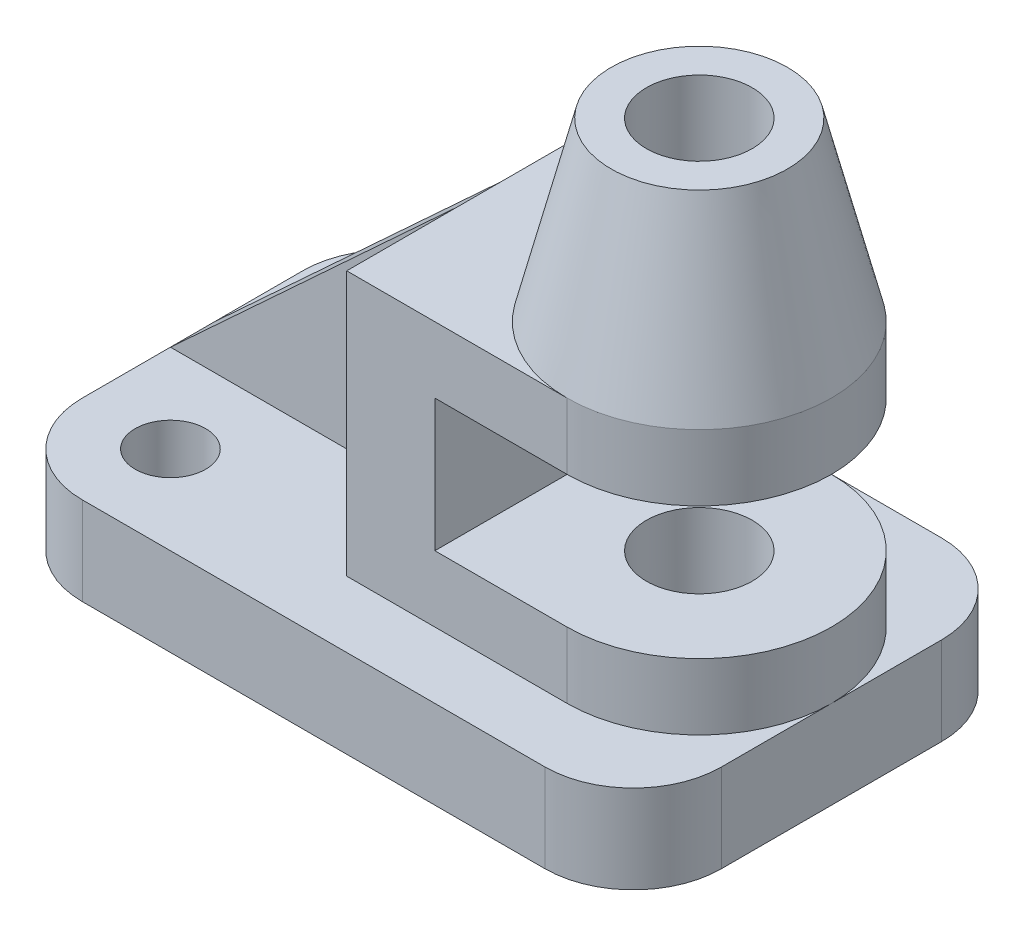
ISO-10303-21;
HEADER;
FILE_DESCRIPTION(('STEP AP214'),'2;1');
FILE_NAME('part.step','',(''),(''),'','','');
FILE_SCHEMA(('AUTOMOTIVE_DESIGN { 1 0 10303 214 1 1 1 1 }'));
ENDSEC;
DATA;
#1=APPLICATION_CONTEXT('core data for automotive mechanical design processes');
#2=APPLICATION_PROTOCOL_DEFINITION('international standard','automotive_design',2000,#1);
#3=PRODUCT_CONTEXT('',#1,'mechanical');
#4=PRODUCT('Part','Part','',(#3));
#5=PRODUCT_RELATED_PRODUCT_CATEGORY('part','',(#4));
#6=PRODUCT_DEFINITION_FORMATION('','',#4);
#7=PRODUCT_DEFINITION_CONTEXT('part definition',#1,'design');
#8=PRODUCT_DEFINITION('design','',#6,#7);
#9=PRODUCT_DEFINITION_SHAPE('','',#8);
#10=(LENGTH_UNIT() NAMED_UNIT(*) SI_UNIT(.MILLI.,.METRE.));
#11=(NAMED_UNIT(*) PLANE_ANGLE_UNIT() SI_UNIT($,.RADIAN.));
#12=(NAMED_UNIT(*) SI_UNIT($,.STERADIAN.) SOLID_ANGLE_UNIT());
#13=UNCERTAINTY_MEASURE_WITH_UNIT(LENGTH_MEASURE(1.E-05),#10,'distance_accuracy_value','');
#14=(GEOMETRIC_REPRESENTATION_CONTEXT(3) GLOBAL_UNCERTAINTY_ASSIGNED_CONTEXT((#13)) GLOBAL_UNIT_ASSIGNED_CONTEXT((#10,
#11,#12)) REPRESENTATION_CONTEXT('',''));
#15=CARTESIAN_POINT('',(0.,0.,0.));
#16=DIRECTION('',(0.,0.,1.));
#17=DIRECTION('',(1.,0.,0.));
#18=AXIS2_PLACEMENT_3D('',#15,#16,#17);
#19=CARTESIAN_POINT('',(55.1181876051147,48.213421502715,0.));
#20=DIRECTION('',(0.,-1.,0.));
#21=DIRECTION('',(0.,0.,-1.));
#22=AXIS2_PLACEMENT_3D('',#19,#20,#21);
#23=CYLINDRICAL_SURFACE('',#22,30.);
#24=DIRECTION('',(0.,-1.,0.));
#25=VECTOR('',#24,1.);
#26=CARTESIAN_POINT('',(55.1181876051147,48.213421502715,30.));
#27=LINE('',#26,#25);
#28=CARTESIAN_POINT('',(55.1181876051147,48.213421502715,30.));
#29=VERTEX_POINT('',#28);
#30=CARTESIAN_POINT('',(55.1181876051147,33.213421502715,30.));
#31=VERTEX_POINT('',#30);
#32=EDGE_CURVE('E187',#29,#31,#27,.T.);
#33=ORIENTED_EDGE('',*,*,#32,.T.);
#34=CARTESIAN_POINT('',(55.1181876051147,33.213421502715,0.));
#35=DIRECTION('',(0.,1.,0.));
#36=DIRECTION('',(0.,0.,1.));
#37=AXIS2_PLACEMENT_3D('',#34,#35,#36);
#38=CIRCLE('',#37,30.);
#39=CARTESIAN_POINT('',(55.1181876051147,33.213421502715,-30.));
#40=VERTEX_POINT('',#39);
#41=EDGE_CURVE('E360',#31,#40,#38,.T.);
#42=ORIENTED_EDGE('',*,*,#41,.T.);
#43=DIRECTION('',(0.,-1.,0.));
#44=VECTOR('',#43,1.);
#45=CARTESIAN_POINT('',(55.1181876051147,48.213421502715,-30.));
#46=LINE('',#45,#44);
#47=CARTESIAN_POINT('',(55.1181876051147,48.213421502715,-30.));
#48=VERTEX_POINT('',#47);
#49=EDGE_CURVE('E197',#48,#40,#46,.T.);
#50=ORIENTED_EDGE('',*,*,#49,.F.);
#51=CARTESIAN_POINT('',(55.1181876051147,48.213421502715,0.));
#52=DIRECTION('',(0.,1.,0.));
#53=DIRECTION('',(0.,0.,1.));
#54=AXIS2_PLACEMENT_3D('',#51,#52,#53);
#55=CIRCLE('',#54,30.);
#56=EDGE_CURVE('E168',#29,#48,#55,.T.);
#57=ORIENTED_EDGE('',*,*,#56,.F.);
#58=EDGE_LOOP('',(#33,#42,#50,#57));
#59=FACE_BOUND('',#58,.T.);
#60=ADVANCED_FACE('F32',(#59),#23,.T.);
#61=CARTESIAN_POINT('',(-59.8818123948853,-11.786578497285,45.));
#62=DIRECTION('',(1.,0.,0.));
#63=DIRECTION('',(0.,0.,-1.));
#64=AXIS2_PLACEMENT_3D('',#61,#62,#63);
#65=PLANE('',#64);
#66=DIRECTION('',(0.,0.,-1.));
#67=VECTOR('',#66,1.);
#68=CARTESIAN_POINT('',(-59.8818123948853,-11.786578497285,45.));
#69=LINE('',#68,#67);
#70=CARTESIAN_POINT('',(-59.8818123948853,-11.786578497285,-4.99999999999998));
#71=VERTEX_POINT('',#70);
#72=CARTESIAN_POINT('',(-59.8818123948853,-11.786578497285,-25.));
#73=VERTEX_POINT('',#72);
#74=EDGE_CURVE('E253',#71,#73,#69,.T.);
#75=ORIENTED_EDGE('',*,*,#74,.T.);
#76=DIRECTION('',(0.,-1.,0.));
#77=VECTOR('',#76,1.);
#78=CARTESIAN_POINT('',(-59.8818123948853,-11.786578497285,-25.));
#79=LINE('',#78,#77);
#80=CARTESIAN_POINT('',(-59.8818123948853,-31.786578497285,-25.));
#81=VERTEX_POINT('',#80);
#82=EDGE_CURVE('E284',#73,#81,#79,.T.);
#83=ORIENTED_EDGE('',*,*,#82,.T.);
#84=DIRECTION('',(0.,0.,-1.));
#85=VECTOR('',#84,1.);
#86=CARTESIAN_POINT('',(-59.8818123948853,-31.786578497285,45.));
#87=LINE('',#86,#85);
#88=CARTESIAN_POINT('',(-59.8818123948853,-31.786578497285,25.));
#89=VERTEX_POINT('',#88);
#90=EDGE_CURVE('E250',#89,#81,#87,.T.);
#91=ORIENTED_EDGE('',*,*,#90,.F.);
#92=DIRECTION('',(0.,-1.,0.));
#93=VECTOR('',#92,1.);
#94=CARTESIAN_POINT('',(-59.8818123948853,-11.786578497285,25.));
#95=LINE('',#94,#93);
#96=CARTESIAN_POINT('',(-59.8818123948853,-11.786578497285,25.));
#97=VERTEX_POINT('',#96);
#98=EDGE_CURVE('E279',#89,#97,#95,.F.);
#99=ORIENTED_EDGE('',*,*,#98,.T.);
#100=CARTESIAN_POINT('',(-59.8818123948853,-11.786578497285,5.));
#101=VERTEX_POINT('',#100);
#102=EDGE_CURVE('E254',#97,#101,#69,.T.);
#103=ORIENTED_EDGE('',*,*,#102,.T.);
#104=DIRECTION('',(0.,0.,-1.));
#105=VECTOR('',#104,1.);
#106=CARTESIAN_POINT('',(-59.8818123948853,-11.786578497285,240.600960312135));
#107=LINE('',#106,#105);
#108=EDGE_CURVE('E208',#101,#71,#107,.T.);
#109=ORIENTED_EDGE('',*,*,#108,.T.);
#110=EDGE_LOOP('',(#75,#83,#91,#99,#103,#109));
#111=FACE_BOUND('',#110,.T.);
#112=ADVANCED_FACE('F332',(#111),#65,.F.);
#113=CARTESIAN_POINT('',(0.,48.213421502715,5.00000000000001));
#114=DIRECTION('',(0.,0.,-1.));
#115=DIRECTION('',(-1.,0.,0.));
#116=AXIS2_PLACEMENT_3D('',#113,#114,#115);
#117=PLANE('',#116);
#118=DIRECTION('',(-0.734803444627488,-0.678280102733066,0.));
#119=VECTOR('',#118,1.);
#120=CARTESIAN_POINT('',(-59.8818123948853,-11.786578497285,5.));
#121=LINE('',#120,#119);
#122=CARTESIAN_POINT('',(5.11818760511466,48.213421502715,5.00000000000001));
#123=VERTEX_POINT('',#122);
#124=EDGE_CURVE('E421',#123,#101,#121,.T.);
#125=ORIENTED_EDGE('',*,*,#124,.T.);
#126=DIRECTION('',(1.,0.,0.));
#127=VECTOR('',#126,1.);
#128=CARTESIAN_POINT('',(0.,-11.786578497285,5.00000000000001));
#129=LINE('',#128,#127);
#130=CARTESIAN_POINT('',(5.11818760511466,-11.786578497285,5.00000000000001));
#131=VERTEX_POINT('',#130);
#132=EDGE_CURVE('E205',#101,#131,#129,.T.);
#133=ORIENTED_EDGE('',*,*,#132,.T.);
#134=DIRECTION('',(0.,-1.,0.));
#135=VECTOR('',#134,1.);
#136=CARTESIAN_POINT('',(5.11818760511466,48.213421502715,5.00000000000001));
#137=LINE('',#136,#135);
#138=EDGE_CURVE('E232',#123,#131,#137,.T.);
#139=ORIENTED_EDGE('',*,*,#138,.F.);
#140=EDGE_LOOP('',(#125,#133,#139));
#141=FACE_BOUND('',#140,.T.);
#142=ADVANCED_FACE('F338',(#141),#117,.F.);
#143=CARTESIAN_POINT('',(0.,48.213421502715,0.));
#144=DIRECTION('',(0.,1.,0.));
#145=DIRECTION('',(0.,0.,1.));
#146=AXIS2_PLACEMENT_3D('',#143,#144,#145);
#147=PLANE('',#146);
#148=DIRECTION('',(1.,0.,0.));
#149=VECTOR('',#148,1.);
#150=CARTESIAN_POINT('',(0.,48.213421502715,30.));
#151=LINE('',#150,#149);
#152=CARTESIAN_POINT('',(5.11818760511466,48.213421502715,30.));
#153=VERTEX_POINT('',#152);
#154=EDGE_CURVE('E177',#153,#29,#151,.T.);
#155=ORIENTED_EDGE('',*,*,#154,.T.);
#156=CARTESIAN_POINT('',(55.1181876051147,48.213421502715,0.));
#157=DIRECTION('',(0.,-1.,0.));
#158=DIRECTION('',(0.,0.,-1.));
#159=AXIS2_PLACEMENT_3D('',#156,#157,#158);
#160=CIRCLE('',#159,30.);
#161=EDGE_CURVE('E163',#29,#48,#160,.T.);
#162=ORIENTED_EDGE('',*,*,#161,.T.);
#163=DIRECTION('',(1.,0.,0.));
#164=VECTOR('',#163,1.);
#165=CARTESIAN_POINT('',(0.,48.213421502715,-30.));
#166=LINE('',#165,#164);
#167=CARTESIAN_POINT('',(5.11818760511466,48.213421502715,-30.));
#168=VERTEX_POINT('',#167);
#169=EDGE_CURVE('E199',#168,#48,#166,.T.);
#170=ORIENTED_EDGE('',*,*,#169,.F.);
#171=DIRECTION('',(0.,0.,-1.));
#172=VECTOR('',#171,1.);
#173=CARTESIAN_POINT('',(5.11818760511466,48.213421502715,0.));
#174=LINE('',#173,#172);
#175=CARTESIAN_POINT('',(5.11818760511466,48.213421502715,-4.99999999999998));
#176=VERTEX_POINT('',#175);
#177=EDGE_CURVE('E201',#176,#168,#174,.T.);
#178=ORIENTED_EDGE('',*,*,#177,.F.);
#179=DIRECTION('',(0.,0.,-1.));
#180=VECTOR('',#179,1.);
#181=CARTESIAN_POINT('',(5.11818760511466,48.213421502715,240.600960312135));
#182=LINE('',#181,#180);
#183=EDGE_CURVE('E400',#123,#176,#182,.T.);
#184=ORIENTED_EDGE('',*,*,#183,.F.);
#185=EDGE_CURVE('E182',#153,#123,#174,.T.);
#186=ORIENTED_EDGE('',*,*,#185,.F.);
#187=EDGE_LOOP('',(#155,#162,#170,#178,#184,#186));
#188=FACE_BOUND('',#187,.T.);
#189=ADVANCED_FACE('F179',(#188),#147,.T.);
#190=CARTESIAN_POINT('',(85.1181876051147,-11.786578497285,45.));
#191=DIRECTION('',(0.,-1.,0.));
#192=DIRECTION('',(0.,0.,-1.));
#193=AXIS2_PLACEMENT_3D('',#190,#191,#192);
#194=PLANE('',#193);
#195=CARTESIAN_POINT('',(-39.8818123948853,-11.786578497285,25.));
#196=DIRECTION('',(0.,1.,0.));
#197=DIRECTION('',(0.,0.,1.));
#198=AXIS2_PLACEMENT_3D('',#195,#196,#197);
#199=CIRCLE('',#198,8.00000000000001);
#200=CARTESIAN_POINT('',(-39.8818123948853,-11.786578497285,33.));
#201=VERTEX_POINT('',#200);
#202=EDGE_CURVE('E271',#201,#201,#199,.T.);
#203=ORIENTED_EDGE('',*,*,#202,.F.);
#204=EDGE_LOOP('',(#203));
#205=FACE_BOUND('',#204,.T.);
#206=DIRECTION('',(-1.,0.,0.));
#207=VECTOR('',#206,1.);
#208=CARTESIAN_POINT('',(85.1181876051147,-11.786578497285,45.));
#209=LINE('',#208,#207);
#210=CARTESIAN_POINT('',(65.1181876051147,-11.786578497285,45.));
#211=VERTEX_POINT('',#210);
#212=CARTESIAN_POINT('',(-39.8818123948853,-11.786578497285,45.));
#213=VERTEX_POINT('',#212);
#214=EDGE_CURVE('E236',#211,#213,#209,.T.);
#215=ORIENTED_EDGE('',*,*,#214,.F.);
#216=CARTESIAN_POINT('',(65.1181876051147,-11.786578497285,25.));
#217=DIRECTION('',(0.,-1.,0.));
#218=DIRECTION('',(0.,0.,-1.));
#219=AXIS2_PLACEMENT_3D('',#216,#217,#218);
#220=CIRCLE('',#219,20.);
#221=CARTESIAN_POINT('',(85.1181876051147,-11.786578497285,25.));
#222=VERTEX_POINT('',#221);
#223=EDGE_CURVE('E54',#211,#222,#220,.F.);
#224=ORIENTED_EDGE('',*,*,#223,.T.);
#225=DIRECTION('',(0.,0.,-1.));
#226=VECTOR('',#225,1.);
#227=CARTESIAN_POINT('',(85.1181876051147,-11.786578497285,45.));
#228=LINE('',#227,#226);
#229=CARTESIAN_POINT('',(85.1181876051147,-11.786578497285,0.));
#230=VERTEX_POINT('',#229);
#231=EDGE_CURVE('E246',#222,#230,#228,.T.);
#232=ORIENTED_EDGE('',*,*,#231,.T.);
#233=CARTESIAN_POINT('',(55.1181876051147,-11.786578497285,0.));
#234=DIRECTION('',(0.,1.,0.));
#235=DIRECTION('',(0.,0.,1.));
#236=AXIS2_PLACEMENT_3D('',#233,#234,#235);
#237=CIRCLE('',#236,30.);
#238=CARTESIAN_POINT('',(55.1181876051147,-11.786578497285,30.));
#239=VERTEX_POINT('',#238);
#240=EDGE_CURVE('E215',#239,#230,#237,.T.);
#241=ORIENTED_EDGE('',*,*,#240,.F.);
#242=DIRECTION('',(1.,0.,0.));
#243=VECTOR('',#242,1.);
#244=CARTESIAN_POINT('',(0.,-11.786578497285,30.));
#245=LINE('',#244,#243);
#246=CARTESIAN_POINT('',(5.11818760511466,-11.786578497285,30.));
#247=VERTEX_POINT('',#246);
#248=EDGE_CURVE('E211',#247,#239,#245,.T.);
#249=ORIENTED_EDGE('',*,*,#248,.F.);
#250=DIRECTION('',(0.,0.,-1.));
#251=VECTOR('',#250,1.);
#252=CARTESIAN_POINT('',(5.11818760511466,-11.786578497285,0.));
#253=LINE('',#252,#251);
#254=EDGE_CURVE('E207',#247,#131,#253,.T.);
#255=ORIENTED_EDGE('',*,*,#254,.T.);
#256=ORIENTED_EDGE('',*,*,#132,.F.);
#257=ORIENTED_EDGE('',*,*,#102,.F.);
#258=CARTESIAN_POINT('',(-39.8818123948853,-11.786578497285,25.));
#259=DIRECTION('',(0.,-1.,0.));
#260=DIRECTION('',(0.,0.,-1.));
#261=AXIS2_PLACEMENT_3D('',#258,#259,#260);
#262=CIRCLE('',#261,20.);
#263=EDGE_CURVE('E281',#97,#213,#262,.F.);
#264=ORIENTED_EDGE('',*,*,#263,.T.);
#265=EDGE_LOOP('',(#215,#224,#232,#241,#249,#255,#256,#257,#264));
#266=FACE_BOUND('',#265,.T.);
#267=ADVANCED_FACE('F313',(#205,#266),#194,.F.);
#268=CARTESIAN_POINT('',(-39.8818123948853,-11.786578497285,-25.));
#269=DIRECTION('',(0.,1.,0.));
#270=DIRECTION('',(0.,0.,1.));
#271=AXIS2_PLACEMENT_3D('',#268,#269,#270);
#272=CIRCLE('',#271,8.00000000000001);
#273=CARTESIAN_POINT('',(-39.8818123948853,-11.786578497285,-17.));
#274=VERTEX_POINT('',#273);
#275=EDGE_CURVE('E441',#274,#274,#272,.T.);
#276=ORIENTED_EDGE('',*,*,#275,.F.);
#277=EDGE_LOOP('',(#276));
#278=FACE_BOUND('',#277,.T.);
#279=CARTESIAN_POINT('',(85.1181876051147,-11.786578497285,-25.));
#280=VERTEX_POINT('',#279);
#281=EDGE_CURVE('E242',#230,#280,#228,.T.);
#282=ORIENTED_EDGE('',*,*,#281,.T.);
#283=CARTESIAN_POINT('',(65.1181876051147,-11.786578497285,-25.));
#284=DIRECTION('',(0.,-1.,0.));
#285=DIRECTION('',(0.,0.,-1.));
#286=AXIS2_PLACEMENT_3D('',#283,#284,#285);
#287=CIRCLE('',#286,20.);
#288=CARTESIAN_POINT('',(65.1181876051147,-11.786578497285,-45.));
#289=VERTEX_POINT('',#288);
#290=EDGE_CURVE('E297',#280,#289,#287,.F.);
#291=ORIENTED_EDGE('',*,*,#290,.T.);
#292=DIRECTION('',(-1.,0.,0.));
#293=VECTOR('',#292,1.);
#294=CARTESIAN_POINT('',(85.1181876051147,-11.786578497285,-45.));
#295=LINE('',#294,#293);
#296=CARTESIAN_POINT('',(-39.8818123948853,-11.786578497285,-45.));
#297=VERTEX_POINT('',#296);
#298=EDGE_CURVE('E235',#289,#297,#295,.T.);
#299=ORIENTED_EDGE('',*,*,#298,.T.);
#300=CARTESIAN_POINT('',(-39.8818123948853,-11.786578497285,-25.));
#301=DIRECTION('',(0.,-1.,0.));
#302=DIRECTION('',(0.,0.,-1.));
#303=AXIS2_PLACEMENT_3D('',#300,#301,#302);
#304=CIRCLE('',#303,20.);
#305=EDGE_CURVE('E292',#297,#73,#304,.F.);
#306=ORIENTED_EDGE('',*,*,#305,.T.);
#307=ORIENTED_EDGE('',*,*,#74,.F.);
#308=DIRECTION('',(1.,0.,0.));
#309=VECTOR('',#308,1.);
#310=CARTESIAN_POINT('',(0.,-11.786578497285,-4.99999999999999));
#311=LINE('',#310,#309);
#312=CARTESIAN_POINT('',(5.11818760511466,-11.786578497285,-4.99999999999999));
#313=VERTEX_POINT('',#312);
#314=EDGE_CURVE('E222',#71,#313,#311,.T.);
#315=ORIENTED_EDGE('',*,*,#314,.T.);
#316=CARTESIAN_POINT('',(5.11818760511466,-11.786578497285,-30.));
#317=VERTEX_POINT('',#316);
#318=EDGE_CURVE('E212',#313,#317,#253,.T.);
#319=ORIENTED_EDGE('',*,*,#318,.T.);
#320=DIRECTION('',(1.,0.,0.));
#321=VECTOR('',#320,1.);
#322=CARTESIAN_POINT('',(0.,-11.786578497285,-30.));
#323=LINE('',#322,#321);
#324=CARTESIAN_POINT('',(55.1181876051147,-11.786578497285,-30.));
#325=VERTEX_POINT('',#324);
#326=EDGE_CURVE('E218',#317,#325,#323,.T.);
#327=ORIENTED_EDGE('',*,*,#326,.T.);
#328=EDGE_CURVE('E219',#230,#325,#237,.T.);
#329=ORIENTED_EDGE('',*,*,#328,.F.);
#330=EDGE_LOOP('',(#282,#291,#299,#306,#307,#315,#319,#327,#329));
#331=FACE_BOUND('',#330,.T.);
#332=ADVANCED_FACE('F378',(#278,#331),#194,.F.);
#333=CARTESIAN_POINT('',(-59.8818123948853,-31.786578497285,45.));
#334=DIRECTION('',(0.,1.,0.));
#335=DIRECTION('',(0.,0.,1.));
#336=AXIS2_PLACEMENT_3D('',#333,#334,#335);
#337=PLANE('',#336);
#338=CARTESIAN_POINT('',(-39.8818123948853,-31.786578497285,25.));
#339=DIRECTION('',(0.,1.,0.));
#340=DIRECTION('',(0.,0.,1.));
#341=AXIS2_PLACEMENT_3D('',#338,#339,#340);
#342=CIRCLE('',#341,8.00000000000001);
#343=CARTESIAN_POINT('',(-39.8818123948853,-31.786578497285,33.));
#344=VERTEX_POINT('',#343);
#345=EDGE_CURVE('E270',#344,#344,#342,.T.);
#346=ORIENTED_EDGE('',*,*,#345,.T.);
#347=EDGE_LOOP('',(#346));
#348=FACE_BOUND('',#347,.T.);
#349=CARTESIAN_POINT('',(-39.8818123948853,-31.786578497285,-25.));
#350=DIRECTION('',(0.,1.,0.));
#351=DIRECTION('',(0.,0.,1.));
#352=AXIS2_PLACEMENT_3D('',#349,#350,#351);
#353=CIRCLE('',#352,8.00000000000001);
#354=CARTESIAN_POINT('',(-39.8818123948853,-31.786578497285,-17.));
#355=VERTEX_POINT('',#354);
#356=EDGE_CURVE('E267',#355,#355,#353,.T.);
#357=ORIENTED_EDGE('',*,*,#356,.T.);
#358=EDGE_LOOP('',(#357));
#359=FACE_BOUND('',#358,.T.);
#360=CARTESIAN_POINT('',(55.1181876051147,-31.786578497285,0.));
#361=DIRECTION('',(0.,1.,0.));
#362=DIRECTION('',(0.,0.,1.));
#363=AXIS2_PLACEMENT_3D('',#360,#361,#362);
#364=CIRCLE('',#363,12.);
#365=CARTESIAN_POINT('',(55.1181876051147,-31.786578497285,12.));
#366=VERTEX_POINT('',#365);
#367=EDGE_CURVE('E430',#366,#366,#364,.F.);
#368=ORIENTED_EDGE('',*,*,#367,.F.);
#369=EDGE_LOOP('',(#368));
#370=FACE_BOUND('',#369,.T.);
#371=DIRECTION('',(0.,0.,-1.));
#372=VECTOR('',#371,1.);
#373=CARTESIAN_POINT('',(85.1181876051147,-31.786578497285,45.));
#374=LINE('',#373,#372);
#375=CARTESIAN_POINT('',(85.1181876051147,-31.786578497285,25.));
#376=VERTEX_POINT('',#375);
#377=CARTESIAN_POINT('',(85.1181876051147,-31.786578497285,-25.));
#378=VERTEX_POINT('',#377);
#379=EDGE_CURVE('E248',#376,#378,#374,.T.);
#380=ORIENTED_EDGE('',*,*,#379,.F.);
#381=CARTESIAN_POINT('',(65.1181876051147,-31.786578497285,25.));
#382=DIRECTION('',(0.,1.,0.));
#383=DIRECTION('',(0.,0.,1.));
#384=AXIS2_PLACEMENT_3D('',#381,#382,#383);
#385=CIRCLE('',#384,20.);
#386=CARTESIAN_POINT('',(65.1181876051147,-31.786578497285,45.));
#387=VERTEX_POINT('',#386);
#388=EDGE_CURVE('E11',#376,#387,#385,.F.);
#389=ORIENTED_EDGE('',*,*,#388,.T.);
#390=DIRECTION('',(1.,0.,0.));
#391=VECTOR('',#390,1.);
#392=CARTESIAN_POINT('',(-59.8818123948853,-31.786578497285,45.));
#393=LINE('',#392,#391);
#394=CARTESIAN_POINT('',(-39.8818123948853,-31.786578497285,45.));
#395=VERTEX_POINT('',#394);
#396=EDGE_CURVE('E238',#395,#387,#393,.T.);
#397=ORIENTED_EDGE('',*,*,#396,.F.);
#398=CARTESIAN_POINT('',(-39.8818123948853,-31.786578497285,25.));
#399=DIRECTION('',(0.,1.,0.));
#400=DIRECTION('',(0.,0.,1.));
#401=AXIS2_PLACEMENT_3D('',#398,#399,#400);
#402=CIRCLE('',#401,20.);
#403=EDGE_CURVE('E277',#395,#89,#402,.F.);
#404=ORIENTED_EDGE('',*,*,#403,.T.);
#405=ORIENTED_EDGE('',*,*,#90,.T.);
#406=CARTESIAN_POINT('',(-39.8818123948853,-31.786578497285,-25.));
#407=DIRECTION('',(0.,1.,0.));
#408=DIRECTION('',(0.,0.,1.));
#409=AXIS2_PLACEMENT_3D('',#406,#407,#408);
#410=CIRCLE('',#409,20.);
#411=CARTESIAN_POINT('',(-39.8818123948853,-31.786578497285,-45.));
#412=VERTEX_POINT('',#411);
#413=EDGE_CURVE('E287',#81,#412,#410,.F.);
#414=ORIENTED_EDGE('',*,*,#413,.T.);
#415=DIRECTION('',(1.,0.,0.));
#416=VECTOR('',#415,1.);
#417=CARTESIAN_POINT('',(-59.8818123948853,-31.786578497285,-45.));
#418=LINE('',#417,#416);
#419=CARTESIAN_POINT('',(65.1181876051147,-31.786578497285,-45.));
#420=VERTEX_POINT('',#419);
#421=EDGE_CURVE('E239',#412,#420,#418,.T.);
#422=ORIENTED_EDGE('',*,*,#421,.T.);
#423=CARTESIAN_POINT('',(65.1181876051147,-31.786578497285,-25.));
#424=DIRECTION('',(0.,1.,0.));
#425=DIRECTION('',(0.,0.,1.));
#426=AXIS2_PLACEMENT_3D('',#423,#424,#425);
#427=CIRCLE('',#426,20.);
#428=EDGE_CURVE('E301',#420,#378,#427,.F.);
#429=ORIENTED_EDGE('',*,*,#428,.T.);
#430=EDGE_LOOP('',(#380,#389,#397,#404,#405,#414,#422,#429));
#431=FACE_BOUND('',#430,.T.);
#432=ADVANCED_FACE('F322',(#348,#359,#370,#431),#337,.F.);
#433=CARTESIAN_POINT('',(85.1181876051147,-31.786578497285,45.));
#434=DIRECTION('',(-1.,0.,0.));
#435=DIRECTION('',(0.,0.,1.));
#436=AXIS2_PLACEMENT_3D('',#433,#434,#435);
#437=PLANE('',#436);
#438=ORIENTED_EDGE('',*,*,#231,.F.);
#439=DIRECTION('',(0.,1.,0.));
#440=VECTOR('',#439,1.);
#441=CARTESIAN_POINT('',(85.1181876051147,-31.786578497285,25.));
#442=LINE('',#441,#440);
#443=EDGE_CURVE('E40',#222,#376,#442,.F.);
#444=ORIENTED_EDGE('',*,*,#443,.T.);
#445=ORIENTED_EDGE('',*,*,#379,.T.);
#446=DIRECTION('',(0.,1.,0.));
#447=VECTOR('',#446,1.);
#448=CARTESIAN_POINT('',(85.1181876051147,-31.786578497285,-25.));
#449=LINE('',#448,#447);
#450=EDGE_CURVE('E294',#378,#280,#449,.T.);
#451=ORIENTED_EDGE('',*,*,#450,.T.);
#452=ORIENTED_EDGE('',*,*,#281,.F.);
#453=EDGE_LOOP('',(#438,#444,#445,#451,#452));
#454=FACE_BOUND('',#453,.T.);
#455=ADVANCED_FACE('F381',(#454),#437,.F.);
#456=CARTESIAN_POINT('',(0.,0.,45.));
#457=DIRECTION('',(0.,0.,1.));
#458=DIRECTION('',(1.,0.,0.));
#459=AXIS2_PLACEMENT_3D('',#456,#457,#458);
#460=PLANE('',#459);
#461=ORIENTED_EDGE('',*,*,#396,.T.);
#462=DIRECTION('',(0.,1.,0.));
#463=VECTOR('',#462,1.);
#464=CARTESIAN_POINT('',(65.1181876051147,-11.786578497285,45.));
#465=LINE('',#464,#463);
#466=EDGE_CURVE('E304',#387,#211,#465,.T.);
#467=ORIENTED_EDGE('',*,*,#466,.T.);
#468=ORIENTED_EDGE('',*,*,#214,.T.);
#469=DIRECTION('',(0.,-1.,0.));
#470=VECTOR('',#469,1.);
#471=CARTESIAN_POINT('',(-39.8818123948853,-31.786578497285,45.));
#472=LINE('',#471,#470);
#473=EDGE_CURVE('E172',#213,#395,#472,.T.);
#474=ORIENTED_EDGE('',*,*,#473,.T.);
#475=EDGE_LOOP('',(#461,#467,#468,#474));
#476=FACE_BOUND('',#475,.T.);
#477=ADVANCED_FACE('F309',(#476),#460,.T.);
#478=CARTESIAN_POINT('',(0.,0.,-45.));
#479=DIRECTION('',(0.,0.,1.));
#480=DIRECTION('',(1.,0.,0.));
#481=AXIS2_PLACEMENT_3D('',#478,#479,#480);
#482=PLANE('',#481);
#483=ORIENTED_EDGE('',*,*,#298,.F.);
#484=DIRECTION('',(0.,1.,0.));
#485=VECTOR('',#484,1.);
#486=CARTESIAN_POINT('',(65.1181876051147,0.,-45.));
#487=LINE('',#486,#485);
#488=EDGE_CURVE('E299',#289,#420,#487,.F.);
#489=ORIENTED_EDGE('',*,*,#488,.T.);
#490=ORIENTED_EDGE('',*,*,#421,.F.);
#491=DIRECTION('',(0.,-1.,0.));
#492=VECTOR('',#491,1.);
#493=CARTESIAN_POINT('',(-39.8818123948853,0.,-45.));
#494=LINE('',#493,#492);
#495=EDGE_CURVE('E289',#412,#297,#494,.F.);
#496=ORIENTED_EDGE('',*,*,#495,.T.);
#497=EDGE_LOOP('',(#483,#489,#490,#496));
#498=FACE_BOUND('',#497,.T.);
#499=ADVANCED_FACE('F387',(#498),#482,.F.);
#500=CARTESIAN_POINT('',(5.11818760511466,48.213421502715,0.));
#501=DIRECTION('',(-1.,0.,0.));
#502=DIRECTION('',(0.,0.,1.));
#503=AXIS2_PLACEMENT_3D('',#500,#501,#502);
#504=PLANE('',#503);
#505=ORIENTED_EDGE('',*,*,#254,.F.);
#506=DIRECTION('',(0.,-1.,0.));
#507=VECTOR('',#506,1.);
#508=CARTESIAN_POINT('',(5.11818760511466,48.213421502715,30.));
#509=LINE('',#508,#507);
#510=EDGE_CURVE('E193',#153,#247,#509,.T.);
#511=ORIENTED_EDGE('',*,*,#510,.F.);
#512=ORIENTED_EDGE('',*,*,#185,.T.);
#513=ORIENTED_EDGE('',*,*,#138,.T.);
#514=EDGE_LOOP('',(#505,#511,#512,#513));
#515=FACE_BOUND('',#514,.T.);
#516=ADVANCED_FACE('F352',(#515),#504,.T.);
#517=CARTESIAN_POINT('',(0.,48.213421502715,30.));
#518=DIRECTION('',(0.,0.,-1.));
#519=DIRECTION('',(-1.,0.,0.));
#520=AXIS2_PLACEMENT_3D('',#517,#518,#519);
#521=PLANE('',#520);
#522=DIRECTION('',(0.,-1.,0.));
#523=VECTOR('',#522,1.);
#524=CARTESIAN_POINT('',(25.1181876051147,33.213421502715,30.));
#525=LINE('',#524,#523);
#526=CARTESIAN_POINT('',(25.1181876051147,33.213421502715,30.));
#527=VERTEX_POINT('',#526);
#528=CARTESIAN_POINT('',(25.1181876051147,3.213421502715,30.));
#529=VERTEX_POINT('',#528);
#530=EDGE_CURVE('E369',#527,#529,#525,.T.);
#531=ORIENTED_EDGE('',*,*,#530,.F.);
#532=DIRECTION('',(-1.,0.,0.));
#533=VECTOR('',#532,1.);
#534=CARTESIAN_POINT('',(85.1181876051147,33.213421502715,30.));
#535=LINE('',#534,#533);
#536=EDGE_CURVE('E191',#31,#527,#535,.T.);
#537=ORIENTED_EDGE('',*,*,#536,.F.);
#538=ORIENTED_EDGE('',*,*,#32,.F.);
#539=ORIENTED_EDGE('',*,*,#154,.F.);
#540=ORIENTED_EDGE('',*,*,#510,.T.);
#541=ORIENTED_EDGE('',*,*,#248,.T.);
#542=CARTESIAN_POINT('',(55.1181876051147,3.213421502715,30.));
#543=VERTEX_POINT('',#542);
#544=EDGE_CURVE('E194',#543,#239,#27,.T.);
#545=ORIENTED_EDGE('',*,*,#544,.F.);
#546=DIRECTION('',(1.,0.,0.));
#547=VECTOR('',#546,1.);
#548=CARTESIAN_POINT('',(25.1181876051147,3.213421502715,30.));
#549=LINE('',#548,#547);
#550=EDGE_CURVE('E364',#529,#543,#549,.T.);
#551=ORIENTED_EDGE('',*,*,#550,.F.);
#552=EDGE_LOOP('',(#531,#537,#538,#539,#540,#541,#545,#551));
#553=FACE_BOUND('',#552,.T.);
#554=ADVANCED_FACE('F189',(#553),#521,.F.);
#555=CARTESIAN_POINT('',(55.1181876051147,3.213421502715,0.));
#556=DIRECTION('',(0.,-1.,0.));
#557=DIRECTION('',(0.,0.,-1.));
#558=AXIS2_PLACEMENT_3D('',#555,#556,#557);
#559=CIRCLE('',#558,30.);
#560=CARTESIAN_POINT('',(55.1181876051147,3.213421502715,-30.));
#561=VERTEX_POINT('',#560);
#562=EDGE_CURVE('E354',#561,#543,#559,.T.);
#563=ORIENTED_EDGE('',*,*,#562,.T.);
#564=ORIENTED_EDGE('',*,*,#544,.T.);
#565=ORIENTED_EDGE('',*,*,#240,.T.);
#566=ORIENTED_EDGE('',*,*,#328,.T.);
#567=EDGE_CURVE('E229',#561,#325,#46,.T.);
#568=ORIENTED_EDGE('',*,*,#567,.F.);
#569=EDGE_LOOP('',(#563,#564,#565,#566,#568));
#570=FACE_BOUND('',#569,.T.);
#571=ADVANCED_FACE('F334',(#570),#23,.T.);
#572=CARTESIAN_POINT('',(0.,48.213421502715,-30.));
#573=DIRECTION('',(0.,0.,-1.));
#574=DIRECTION('',(-1.,0.,0.));
#575=AXIS2_PLACEMENT_3D('',#572,#573,#574);
#576=PLANE('',#575);
#577=DIRECTION('',(1.,0.,0.));
#578=VECTOR('',#577,1.);
#579=CARTESIAN_POINT('',(0.,33.213421502715,-30.));
#580=LINE('',#579,#578);
#581=CARTESIAN_POINT('',(25.1181876051147,33.213421502715,-30.));
#582=VERTEX_POINT('',#581);
#583=EDGE_CURVE('E173',#582,#40,#580,.T.);
#584=ORIENTED_EDGE('',*,*,#583,.F.);
#585=DIRECTION('',(0.,1.,0.));
#586=VECTOR('',#585,1.);
#587=CARTESIAN_POINT('',(25.1181876051147,48.213421502715,-30.));
#588=LINE('',#587,#586);
#589=CARTESIAN_POINT('',(25.1181876051147,3.213421502715,-30.));
#590=VERTEX_POINT('',#589);
#591=EDGE_CURVE('E258',#590,#582,#588,.T.);
#592=ORIENTED_EDGE('',*,*,#591,.F.);
#593=DIRECTION('',(-1.,0.,0.));
#594=VECTOR('',#593,1.);
#595=CARTESIAN_POINT('',(0.,3.213421502715,-30.));
#596=LINE('',#595,#594);
#597=EDGE_CURVE('E256',#561,#590,#596,.T.);
#598=ORIENTED_EDGE('',*,*,#597,.F.);
#599=ORIENTED_EDGE('',*,*,#567,.T.);
#600=ORIENTED_EDGE('',*,*,#326,.F.);
#601=DIRECTION('',(0.,-1.,0.));
#602=VECTOR('',#601,1.);
#603=CARTESIAN_POINT('',(5.11818760511466,48.213421502715,-30.));
#604=LINE('',#603,#602);
#605=EDGE_CURVE('E227',#168,#317,#604,.T.);
#606=ORIENTED_EDGE('',*,*,#605,.F.);
#607=ORIENTED_EDGE('',*,*,#169,.T.);
#608=ORIENTED_EDGE('',*,*,#49,.T.);
#609=EDGE_LOOP('',(#584,#592,#598,#599,#600,#606,#607,#608));
#610=FACE_BOUND('',#609,.T.);
#611=ADVANCED_FACE('F344',(#610),#576,.T.);
#612=ORIENTED_EDGE('',*,*,#318,.F.);
#613=DIRECTION('',(0.,-1.,0.));
#614=VECTOR('',#613,1.);
#615=CARTESIAN_POINT('',(5.11818760511466,48.213421502715,-4.99999999999999));
#616=LINE('',#615,#614);
#617=EDGE_CURVE('E225',#176,#313,#616,.T.);
#618=ORIENTED_EDGE('',*,*,#617,.F.);
#619=ORIENTED_EDGE('',*,*,#177,.T.);
#620=ORIENTED_EDGE('',*,*,#605,.T.);
#621=EDGE_LOOP('',(#612,#618,#619,#620));
#622=FACE_BOUND('',#621,.T.);
#623=ADVANCED_FACE('F350',(#622),#504,.T.);
#624=CARTESIAN_POINT('',(0.,48.213421502715,-4.99999999999999));
#625=DIRECTION('',(0.,0.,-1.));
#626=DIRECTION('',(-1.,0.,0.));
#627=AXIS2_PLACEMENT_3D('',#624,#625,#626);
#628=PLANE('',#627);
#629=DIRECTION('',(-0.734803444627488,-0.678280102733066,0.));
#630=VECTOR('',#629,1.);
#631=CARTESIAN_POINT('',(-59.8818123948853,-11.786578497285,-4.99999999999998));
#632=LINE('',#631,#630);
#633=EDGE_CURVE('E405',#176,#71,#632,.T.);
#634=ORIENTED_EDGE('',*,*,#633,.F.);
#635=ORIENTED_EDGE('',*,*,#617,.T.);
#636=ORIENTED_EDGE('',*,*,#314,.F.);
#637=EDGE_LOOP('',(#634,#635,#636));
#638=FACE_BOUND('',#637,.T.);
#639=ADVANCED_FACE('F404',(#638),#628,.T.);
#640=CARTESIAN_POINT('',(-59.8818123948853,-11.786578497285,240.600960312135));
#641=DIRECTION('',(-0.678280102733066,0.734803444627488,0.));
#642=DIRECTION('',(-0.734803444627488,-0.678280102733066,0.));
#643=AXIS2_PLACEMENT_3D('',#640,#641,#642);
#644=PLANE('',#643);
#645=ORIENTED_EDGE('',*,*,#124,.F.);
#646=ORIENTED_EDGE('',*,*,#183,.T.);
#647=ORIENTED_EDGE('',*,*,#633,.T.);
#648=ORIENTED_EDGE('',*,*,#108,.F.);
#649=EDGE_LOOP('',(#645,#646,#647,#648));
#650=FACE_BOUND('',#649,.T.);
#651=ADVANCED_FACE('F427',(#650),#644,.T.);
#652=CARTESIAN_POINT('',(85.1181876051147,33.213421502715,-60.0000000000001));
#653=DIRECTION('',(0.,1.,0.));
#654=DIRECTION('',(0.,0.,1.));
#655=AXIS2_PLACEMENT_3D('',#652,#653,#654);
#656=PLANE('',#655);
#657=CARTESIAN_POINT('',(55.1181876051147,33.213421502715,0.));
#658=DIRECTION('',(0.,1.,0.));
#659=DIRECTION('',(0.,0.,1.));
#660=AXIS2_PLACEMENT_3D('',#657,#658,#659);
#661=CIRCLE('',#660,12.);
#662=CARTESIAN_POINT('',(55.1181876051147,33.213421502715,12.));
#663=VERTEX_POINT('',#662);
#664=EDGE_CURVE('E265',#663,#663,#661,.F.);
#665=ORIENTED_EDGE('',*,*,#664,.F.);
#666=EDGE_LOOP('',(#665));
#667=FACE_BOUND('',#666,.T.);
#668=ORIENTED_EDGE('',*,*,#536,.T.);
#669=DIRECTION('',(0.,0.,1.));
#670=VECTOR('',#669,1.);
#671=CARTESIAN_POINT('',(25.1181876051147,33.213421502715,-60.0000000000001));
#672=LINE('',#671,#670);
#673=EDGE_CURVE('E361',#582,#527,#672,.T.);
#674=ORIENTED_EDGE('',*,*,#673,.F.);
#675=ORIENTED_EDGE('',*,*,#583,.T.);
#676=ORIENTED_EDGE('',*,*,#41,.F.);
#677=EDGE_LOOP('',(#668,#674,#675,#676));
#678=FACE_BOUND('',#677,.T.);
#679=ADVANCED_FACE('F429',(#667,#678),#656,.F.);
#680=CARTESIAN_POINT('',(25.1181876051147,3.213421502715,-60.0000000000001));
#681=DIRECTION('',(0.,-1.,0.));
#682=DIRECTION('',(0.,0.,-1.));
#683=AXIS2_PLACEMENT_3D('',#680,#681,#682);
#684=PLANE('',#683);
#685=CARTESIAN_POINT('',(55.1181876051147,3.213421502715,0.));
#686=DIRECTION('',(0.,-1.,0.));
#687=DIRECTION('',(0.,0.,-1.));
#688=AXIS2_PLACEMENT_3D('',#685,#686,#687);
#689=CIRCLE('',#688,12.);
#690=CARTESIAN_POINT('',(55.1181876051147,3.213421502715,-12.));
#691=VERTEX_POINT('',#690);
#692=EDGE_CURVE('E262',#691,#691,#689,.F.);
#693=ORIENTED_EDGE('',*,*,#692,.F.);
#694=EDGE_LOOP('',(#693));
#695=FACE_BOUND('',#694,.T.);
#696=ORIENTED_EDGE('',*,*,#562,.F.);
#697=ORIENTED_EDGE('',*,*,#597,.T.);
#698=DIRECTION('',(0.,0.,1.));
#699=VECTOR('',#698,1.);
#700=CARTESIAN_POINT('',(25.1181876051147,3.213421502715,-60.0000000000001));
#701=LINE('',#700,#699);
#702=EDGE_CURVE('E367',#590,#529,#701,.T.);
#703=ORIENTED_EDGE('',*,*,#702,.T.);
#704=ORIENTED_EDGE('',*,*,#550,.T.);
#705=EDGE_LOOP('',(#696,#697,#703,#704));
#706=FACE_BOUND('',#705,.T.);
#707=ADVANCED_FACE('F365',(#695,#706),#684,.F.);
#708=CARTESIAN_POINT('',(25.1181876051147,33.213421502715,-60.0000000000001));
#709=DIRECTION('',(-1.,0.,0.));
#710=DIRECTION('',(0.,0.,1.));
#711=AXIS2_PLACEMENT_3D('',#708,#709,#710);
#712=PLANE('',#711);
#713=ORIENTED_EDGE('',*,*,#591,.T.);
#714=ORIENTED_EDGE('',*,*,#673,.T.);
#715=ORIENTED_EDGE('',*,*,#530,.T.);
#716=ORIENTED_EDGE('',*,*,#702,.F.);
#717=EDGE_LOOP('',(#713,#714,#715,#716));
#718=FACE_BOUND('',#717,.T.);
#719=ADVANCED_FACE('F414',(#718),#712,.F.);
#720=CARTESIAN_POINT('',(55.1181876051147,87.213421502715,0.));
#721=DIRECTION('',(0.,-1.,0.));
#722=DIRECTION('',(0.,0.,-1.));
#723=AXIS2_PLACEMENT_3D('',#720,#721,#722);
#724=CYLINDRICAL_SURFACE('',#723,12.);
#725=ORIENTED_EDGE('',*,*,#692,.T.);
#726=EDGE_LOOP('',(#725));
#727=FACE_BOUND('',#726,.T.);
#728=ORIENTED_EDGE('',*,*,#367,.T.);
#729=EDGE_LOOP('',(#728));
#730=FACE_BOUND('',#729,.T.);
#731=ADVANCED_FACE('F563',(#727,#730),#724,.F.);
#732=ORIENTED_EDGE('',*,*,#664,.T.);
#733=EDGE_LOOP('',(#732));
#734=FACE_BOUND('',#733,.T.);
#735=CARTESIAN_POINT('',(55.1181876051147,88.213421502715,0.));
#736=DIRECTION('',(0.,1.,0.));
#737=DIRECTION('',(0.,0.,1.));
#738=AXIS2_PLACEMENT_3D('',#735,#736,#737);
#739=CIRCLE('',#738,12.);
#740=CARTESIAN_POINT('',(55.1181876051147,88.213421502715,12.));
#741=VERTEX_POINT('',#740);
#742=EDGE_CURVE('E274',#741,#741,#739,.T.);
#743=ORIENTED_EDGE('',*,*,#742,.T.);
#744=EDGE_LOOP('',(#743));
#745=FACE_BOUND('',#744,.T.);
#746=ADVANCED_FACE('F559',(#734,#745),#724,.F.);
#747=CARTESIAN_POINT('',(55.1181876051147,88.213421502715,0.));
#748=DIRECTION('',(0.,-1.,0.));
#749=DIRECTION('',(0.,0.,-1.));
#750=AXIS2_PLACEMENT_3D('',#747,#748,#749);
#751=PLANE('',#750);
#752=ORIENTED_EDGE('',*,*,#742,.F.);
#753=EDGE_LOOP('',(#752));
#754=FACE_BOUND('',#753,.T.);
#755=CARTESIAN_POINT('',(55.1181876051147,88.213421502715,0.));
#756=DIRECTION('',(0.,-1.,0.));
#757=DIRECTION('',(0.,0.,-1.));
#758=AXIS2_PLACEMENT_3D('',#755,#756,#757);
#759=CIRCLE('',#758,20.);
#760=CARTESIAN_POINT('',(55.1181876051147,88.213421502715,-20.));
#761=VERTEX_POINT('',#760);
#762=EDGE_CURVE('E266',#761,#761,#759,.T.);
#763=ORIENTED_EDGE('',*,*,#762,.F.);
#764=EDGE_LOOP('',(#763));
#765=FACE_BOUND('',#764,.T.);
#766=ADVANCED_FACE('F550',(#754,#765),#751,.F.);
#767=CARTESIAN_POINT('',(55.1181876051147,88.213421502715,0.));
#768=DIRECTION('',(0.,-1.,0.));
#769=DIRECTION('',(0.,0.,-1.));
#770=AXIS2_PLACEMENT_3D('',#767,#768,#769);
#771=CONICAL_SURFACE('',#770,20.,0.244978663126864);
#772=ORIENTED_EDGE('',*,*,#56,.T.);
#773=ORIENTED_EDGE('',*,*,#161,.F.);
#774=EDGE_LOOP('',(#772,#773));
#775=FACE_BOUND('',#774,.T.);
#776=ORIENTED_EDGE('',*,*,#762,.T.);
#777=EDGE_LOOP('',(#776));
#778=FACE_BOUND('',#777,.T.);
#779=ADVANCED_FACE('F165',(#775,#778),#771,.T.);
#780=CARTESIAN_POINT('',(-39.8818123948853,-51.786578497285,-25.));
#781=DIRECTION('',(0.,1.,0.));
#782=DIRECTION('',(0.,0.,1.));
#783=AXIS2_PLACEMENT_3D('',#780,#781,#782);
#784=CYLINDRICAL_SURFACE('',#783,8.00000000000001);
#785=ORIENTED_EDGE('',*,*,#275,.T.);
#786=EDGE_LOOP('',(#785));
#787=FACE_BOUND('',#786,.T.);
#788=ORIENTED_EDGE('',*,*,#356,.F.);
#789=EDGE_LOOP('',(#788));
#790=FACE_BOUND('',#789,.T.);
#791=ADVANCED_FACE('F549',(#787,#790),#784,.F.);
#792=CARTESIAN_POINT('',(-39.8818123948853,-51.786578497285,25.));
#793=DIRECTION('',(0.,1.,0.));
#794=DIRECTION('',(0.,0.,1.));
#795=AXIS2_PLACEMENT_3D('',#792,#793,#794);
#796=CYLINDRICAL_SURFACE('',#795,8.00000000000001);
#797=ORIENTED_EDGE('',*,*,#202,.T.);
#798=EDGE_LOOP('',(#797));
#799=FACE_BOUND('',#798,.T.);
#800=ORIENTED_EDGE('',*,*,#345,.F.);
#801=EDGE_LOOP('',(#800));
#802=FACE_BOUND('',#801,.T.);
#803=ADVANCED_FACE('F447',(#799,#802),#796,.F.);
#804=CARTESIAN_POINT('',(-39.8818123948853,0.,25.));
#805=DIRECTION('',(0.,1.,0.));
#806=DIRECTION('',(0.,0.,1.));
#807=AXIS2_PLACEMENT_3D('',#804,#805,#806);
#808=CYLINDRICAL_SURFACE('',#807,20.);
#809=ORIENTED_EDGE('',*,*,#263,.F.);
#810=ORIENTED_EDGE('',*,*,#98,.F.);
#811=ORIENTED_EDGE('',*,*,#403,.F.);
#812=ORIENTED_EDGE('',*,*,#473,.F.);
#813=EDGE_LOOP('',(#809,#810,#811,#812));
#814=FACE_BOUND('',#813,.T.);
#815=ADVANCED_FACE('F320',(#814),#808,.T.);
#816=CARTESIAN_POINT('',(-39.8818123948853,-11.786578497285,-25.));
#817=DIRECTION('',(0.,-1.,0.));
#818=DIRECTION('',(0.,0.,-1.));
#819=AXIS2_PLACEMENT_3D('',#816,#817,#818);
#820=CYLINDRICAL_SURFACE('',#819,20.);
#821=ORIENTED_EDGE('',*,*,#305,.F.);
#822=ORIENTED_EDGE('',*,*,#495,.F.);
#823=ORIENTED_EDGE('',*,*,#413,.F.);
#824=ORIENTED_EDGE('',*,*,#82,.F.);
#825=EDGE_LOOP('',(#821,#822,#823,#824));
#826=FACE_BOUND('',#825,.T.);
#827=ADVANCED_FACE('F329',(#826),#820,.T.);
#828=CARTESIAN_POINT('',(65.1181876051147,-31.786578497285,-25.));
#829=DIRECTION('',(0.,1.,0.));
#830=DIRECTION('',(0.,0.,1.));
#831=AXIS2_PLACEMENT_3D('',#828,#829,#830);
#832=CYLINDRICAL_SURFACE('',#831,20.);
#833=ORIENTED_EDGE('',*,*,#428,.F.);
#834=ORIENTED_EDGE('',*,*,#488,.F.);
#835=ORIENTED_EDGE('',*,*,#290,.F.);
#836=ORIENTED_EDGE('',*,*,#450,.F.);
#837=EDGE_LOOP('',(#833,#834,#835,#836));
#838=FACE_BOUND('',#837,.T.);
#839=ADVANCED_FACE('F325',(#838),#832,.T.);
#840=CARTESIAN_POINT('',(65.1181876051147,0.,25.));
#841=DIRECTION('',(0.,-1.,0.));
#842=DIRECTION('',(0.,0.,-1.));
#843=AXIS2_PLACEMENT_3D('',#840,#841,#842);
#844=CYLINDRICAL_SURFACE('',#843,20.);
#845=ORIENTED_EDGE('',*,*,#388,.F.);
#846=ORIENTED_EDGE('',*,*,#443,.F.);
#847=ORIENTED_EDGE('',*,*,#223,.F.);
#848=ORIENTED_EDGE('',*,*,#466,.F.);
#849=EDGE_LOOP('',(#845,#846,#847,#848));
#850=FACE_BOUND('',#849,.T.);
#851=ADVANCED_FACE('F34',(#850),#844,.T.);
#852=CLOSED_SHELL('',(#60,#112,#142,#189,#267,#332,#432,#455,#477,#499,#516,#554,#571,#611,#623,
#639,#651,#679,#707,#719,#731,#746,#766,#779,#791,#803,#815,#827,#839,#851));
#853=MANIFOLD_SOLID_BREP('B2',#852);
#854=ADVANCED_BREP_SHAPE_REPRESENTATION('',(#18,#853),#14);
#855=SHAPE_DEFINITION_REPRESENTATION(#9,#854);
ENDSEC;
END-ISO-10303-21;
